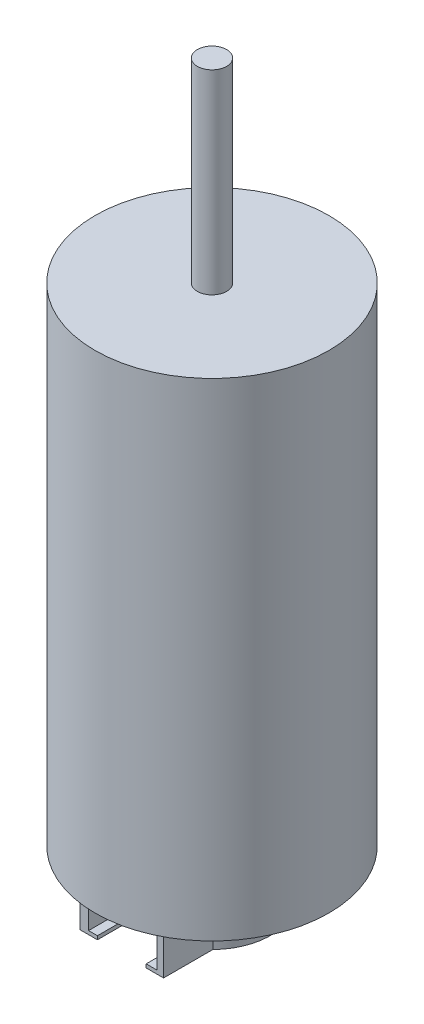
ISO-10303-21;
HEADER;
FILE_DESCRIPTION(('STEP AP214'),'2;1');
FILE_NAME('part.step','',(''),(''),'','','');
FILE_SCHEMA(('AUTOMOTIVE_DESIGN { 1 0 10303 214 1 1 1 1 }'));
ENDSEC;
DATA;
#1=APPLICATION_CONTEXT('core data for automotive mechanical design processes');
#2=APPLICATION_PROTOCOL_DEFINITION('international standard','automotive_design',2000,#1);
#3=PRODUCT_CONTEXT('',#1,'mechanical');
#4=PRODUCT('Part','Part','',(#3));
#5=PRODUCT_RELATED_PRODUCT_CATEGORY('part','',(#4));
#6=PRODUCT_DEFINITION_FORMATION('','',#4);
#7=PRODUCT_DEFINITION_CONTEXT('part definition',#1,'design');
#8=PRODUCT_DEFINITION('design','',#6,#7);
#9=PRODUCT_DEFINITION_SHAPE('','',#8);
#10=(LENGTH_UNIT() NAMED_UNIT(*) SI_UNIT(.MILLI.,.METRE.));
#11=(NAMED_UNIT(*) PLANE_ANGLE_UNIT() SI_UNIT($,.RADIAN.));
#12=(NAMED_UNIT(*) SI_UNIT($,.STERADIAN.) SOLID_ANGLE_UNIT());
#13=UNCERTAINTY_MEASURE_WITH_UNIT(LENGTH_MEASURE(1.E-05),#10,'distance_accuracy_value','');
#14=(GEOMETRIC_REPRESENTATION_CONTEXT(3) GLOBAL_UNCERTAINTY_ASSIGNED_CONTEXT((#13)) GLOBAL_UNIT_ASSIGNED_CONTEXT((#10,
#11,#12)) REPRESENTATION_CONTEXT('',''));
#15=CARTESIAN_POINT('',(0.,0.,0.));
#16=DIRECTION('',(0.,0.,1.));
#17=DIRECTION('',(1.,0.,0.));
#18=AXIS2_PLACEMENT_3D('',#15,#16,#17);
#19=CARTESIAN_POINT('',(0.,0.,0.));
#20=DIRECTION('',(0.,1.,0.));
#21=DIRECTION('',(0.,0.,1.));
#22=AXIS2_PLACEMENT_3D('',#19,#20,#21);
#23=PLANE('',#22);
#24=CARTESIAN_POINT('',(0.,0.,0.));
#25=DIRECTION('',(0.,1.,0.));
#26=DIRECTION('',(0.,0.,1.));
#27=AXIS2_PLACEMENT_3D('',#24,#25,#26);
#28=CIRCLE('',#27,12.);
#29=CARTESIAN_POINT('',(0.,0.,12.));
#30=VERTEX_POINT('',#29);
#31=EDGE_CURVE('E262',#30,#30,#28,.T.);
#32=ORIENTED_EDGE('',*,*,#31,.F.);
#33=EDGE_LOOP('',(#32));
#34=FACE_BOUND('',#33,.T.);
#35=CARTESIAN_POINT('',(0.,0.,0.));
#36=DIRECTION('',(0.,-1.,0.));
#37=DIRECTION('',(0.,0.,-1.));
#38=AXIS2_PLACEMENT_3D('',#35,#36,#37);
#39=CIRCLE('',#38,6.);
#40=CARTESIAN_POINT('',(-4.28427299081036,0.,4.20059578395884));
#41=VERTEX_POINT('',#40);
#42=CARTESIAN_POINT('',(4.28427299081036,0.,4.20059578395884));
#43=VERTEX_POINT('',#42);
#44=EDGE_CURVE('E203',#41,#43,#39,.T.);
#45=ORIENTED_EDGE('',*,*,#44,.F.);
#46=DIRECTION('',(0.,0.,-1.));
#47=VECTOR('',#46,1.);
#48=CARTESIAN_POINT('',(-4.28427299081036,0.,4.20059578395884));
#49=LINE('',#48,#47);
#50=CARTESIAN_POINT('',(-4.28427299081036,0.,9.2543528496582));
#51=VERTEX_POINT('',#50);
#52=EDGE_CURVE('E217',#51,#41,#49,.T.);
#53=ORIENTED_EDGE('',*,*,#52,.F.);
#54=DIRECTION('',(-1.,0.,0.));
#55=VECTOR('',#54,1.);
#56=CARTESIAN_POINT('',(-4.28427299081036,0.,9.2543528496582));
#57=LINE('',#56,#55);
#58=CARTESIAN_POINT('',(4.28427299081036,0.,9.2543528496582));
#59=VERTEX_POINT('',#58);
#60=EDGE_CURVE('E235',#59,#51,#57,.T.);
#61=ORIENTED_EDGE('',*,*,#60,.F.);
#62=DIRECTION('',(0.,0.,1.));
#63=VECTOR('',#62,1.);
#64=CARTESIAN_POINT('',(4.28427299081036,0.,4.20059578395884));
#65=LINE('',#64,#63);
#66=EDGE_CURVE('E231',#43,#59,#65,.T.);
#67=ORIENTED_EDGE('',*,*,#66,.F.);
#68=EDGE_LOOP('',(#45,#53,#61,#67));
#69=FACE_BOUND('',#68,.T.);
#70=ADVANCED_FACE('F43',(#34,#69),#23,.F.);
#71=CARTESIAN_POINT('',(0.,50.,0.));
#72=DIRECTION('',(0.,-1.,0.));
#73=DIRECTION('',(0.,0.,-1.));
#74=AXIS2_PLACEMENT_3D('',#71,#72,#73);
#75=CYLINDRICAL_SURFACE('',#74,12.);
#76=CARTESIAN_POINT('',(0.,50.,0.));
#77=DIRECTION('',(0.,1.,0.));
#78=DIRECTION('',(0.,0.,1.));
#79=AXIS2_PLACEMENT_3D('',#76,#77,#78);
#80=CIRCLE('',#79,12.);
#81=CARTESIAN_POINT('',(0.,50.,12.));
#82=VERTEX_POINT('',#81);
#83=EDGE_CURVE('E266',#82,#82,#80,.T.);
#84=ORIENTED_EDGE('',*,*,#83,.F.);
#85=EDGE_LOOP('',(#84));
#86=FACE_BOUND('',#85,.T.);
#87=ORIENTED_EDGE('',*,*,#31,.T.);
#88=EDGE_LOOP('',(#87));
#89=FACE_BOUND('',#88,.T.);
#90=ADVANCED_FACE('F45',(#86,#89),#75,.T.);
#91=CARTESIAN_POINT('',(0.,50.,0.));
#92=DIRECTION('',(0.,1.,0.));
#93=DIRECTION('',(0.,0.,1.));
#94=AXIS2_PLACEMENT_3D('',#91,#92,#93);
#95=PLANE('',#94);
#96=CARTESIAN_POINT('',(0.,50.,0.));
#97=DIRECTION('',(0.,1.,0.));
#98=DIRECTION('',(0.,0.,1.));
#99=AXIS2_PLACEMENT_3D('',#96,#97,#98);
#100=CIRCLE('',#99,1.5);
#101=CARTESIAN_POINT('',(0.,50.,1.5));
#102=VERTEX_POINT('',#101);
#103=EDGE_CURVE('E257',#102,#102,#100,.T.);
#104=ORIENTED_EDGE('',*,*,#103,.F.);
#105=EDGE_LOOP('',(#104));
#106=FACE_BOUND('',#105,.T.);
#107=ORIENTED_EDGE('',*,*,#83,.T.);
#108=EDGE_LOOP('',(#107));
#109=FACE_BOUND('',#108,.T.);
#110=ADVANCED_FACE('F304',(#106,#109),#95,.T.);
#111=CARTESIAN_POINT('',(0.,70.,0.));
#112=DIRECTION('',(0.,-1.,0.));
#113=DIRECTION('',(0.,0.,-1.));
#114=AXIS2_PLACEMENT_3D('',#111,#112,#113);
#115=CYLINDRICAL_SURFACE('',#114,1.5);
#116=CARTESIAN_POINT('',(0.,70.,0.));
#117=DIRECTION('',(0.,1.,0.));
#118=DIRECTION('',(0.,0.,1.));
#119=AXIS2_PLACEMENT_3D('',#116,#117,#118);
#120=CIRCLE('',#119,1.5);
#121=CARTESIAN_POINT('',(0.,70.,1.5));
#122=VERTEX_POINT('',#121);
#123=EDGE_CURVE('E258',#122,#122,#120,.T.);
#124=ORIENTED_EDGE('',*,*,#123,.F.);
#125=EDGE_LOOP('',(#124));
#126=FACE_BOUND('',#125,.T.);
#127=ORIENTED_EDGE('',*,*,#103,.T.);
#128=EDGE_LOOP('',(#127));
#129=FACE_BOUND('',#128,.T.);
#130=ADVANCED_FACE('F310',(#126,#129),#115,.T.);
#131=CARTESIAN_POINT('',(0.,70.,0.));
#132=DIRECTION('',(0.,1.,0.));
#133=DIRECTION('',(0.,0.,1.));
#134=AXIS2_PLACEMENT_3D('',#131,#132,#133);
#135=PLANE('',#134);
#136=ORIENTED_EDGE('',*,*,#123,.T.);
#137=EDGE_LOOP('',(#136));
#138=FACE_BOUND('',#137,.T.);
#139=ADVANCED_FACE('F314',(#138),#135,.T.);
#140=CARTESIAN_POINT('',(0.,-5.,0.));
#141=DIRECTION('',(0.,1.,0.));
#142=DIRECTION('',(0.,0.,1.));
#143=AXIS2_PLACEMENT_3D('',#140,#141,#142);
#144=CYLINDRICAL_SURFACE('',#143,6.);
#145=ORIENTED_EDGE('',*,*,#44,.T.);
#146=DIRECTION('',(0.,1.,0.));
#147=VECTOR('',#146,1.);
#148=CARTESIAN_POINT('',(4.28427299081036,-5.,4.20059578395884));
#149=LINE('',#148,#147);
#150=CARTESIAN_POINT('',(4.28427299081036,-5.,4.20059578395884));
#151=VERTEX_POINT('',#150);
#152=EDGE_CURVE('E253',#151,#43,#149,.T.);
#153=ORIENTED_EDGE('',*,*,#152,.F.);
#154=CARTESIAN_POINT('',(0.,-5.,0.));
#155=DIRECTION('',(0.,-1.,0.));
#156=DIRECTION('',(0.,0.,-1.));
#157=AXIS2_PLACEMENT_3D('',#154,#155,#156);
#158=CIRCLE('',#157,6.);
#159=CARTESIAN_POINT('',(-4.28427299081036,-5.,4.20059578395884));
#160=VERTEX_POINT('',#159);
#161=EDGE_CURVE('E212',#160,#151,#158,.T.);
#162=ORIENTED_EDGE('',*,*,#161,.F.);
#163=DIRECTION('',(0.,1.,0.));
#164=VECTOR('',#163,1.);
#165=CARTESIAN_POINT('',(-4.28427299081036,-5.,4.20059578395884));
#166=LINE('',#165,#164);
#167=EDGE_CURVE('E227',#160,#41,#166,.T.);
#168=ORIENTED_EDGE('',*,*,#167,.T.);
#169=EDGE_LOOP('',(#145,#153,#162,#168));
#170=FACE_BOUND('',#169,.T.);
#171=ADVANCED_FACE('F294',(#170),#144,.T.);
#172=CARTESIAN_POINT('',(4.28427299081036,-5.,4.20059578395884));
#173=DIRECTION('',(-1.,0.,0.));
#174=DIRECTION('',(0.,0.,1.));
#175=AXIS2_PLACEMENT_3D('',#172,#173,#174);
#176=PLANE('',#175);
#177=ORIENTED_EDGE('',*,*,#66,.T.);
#178=DIRECTION('',(0.,1.,0.));
#179=VECTOR('',#178,1.);
#180=CARTESIAN_POINT('',(4.28427299081036,-5.,9.2543528496582));
#181=LINE('',#180,#179);
#182=CARTESIAN_POINT('',(4.28427299081036,-5.,9.2543528496582));
#183=VERTEX_POINT('',#182);
#184=EDGE_CURVE('E249',#183,#59,#181,.T.);
#185=ORIENTED_EDGE('',*,*,#184,.F.);
#186=DIRECTION('',(0.,0.,1.));
#187=VECTOR('',#186,1.);
#188=CARTESIAN_POINT('',(4.28427299081036,-5.,4.20059578395884));
#189=LINE('',#188,#187);
#190=EDGE_CURVE('E216',#151,#183,#189,.T.);
#191=ORIENTED_EDGE('',*,*,#190,.F.);
#192=ORIENTED_EDGE('',*,*,#152,.T.);
#193=EDGE_LOOP('',(#177,#185,#191,#192));
#194=FACE_BOUND('',#193,.T.);
#195=ADVANCED_FACE('F297',(#194),#176,.F.);
#196=CARTESIAN_POINT('',(-4.28427299081036,-5.,9.2543528496582));
#197=DIRECTION('',(0.,0.,-1.));
#198=DIRECTION('',(-1.,0.,0.));
#199=AXIS2_PLACEMENT_3D('',#196,#197,#198);
#200=PLANE('',#199);
#201=DIRECTION('',(-1.,0.,0.));
#202=VECTOR('',#201,1.);
#203=CARTESIAN_POINT('',(-4.28427299081036,-5.,9.2543528496582));
#204=LINE('',#203,#202);
#205=CARTESIAN_POINT('',(-2.50184735853727,-5.,9.2543528496582));
#206=VERTEX_POINT('',#205);
#207=CARTESIAN_POINT('',(-4.28427299081036,-5.,9.2543528496582));
#208=VERTEX_POINT('',#207);
#209=EDGE_CURVE('E220',#206,#208,#204,.T.);
#210=ORIENTED_EDGE('',*,*,#209,.F.);
#211=DIRECTION('',(0.,-1.,0.));
#212=VECTOR('',#211,1.);
#213=CARTESIAN_POINT('',(-2.50184735853727,-4.6,9.2543528496582));
#214=LINE('',#213,#212);
#215=CARTESIAN_POINT('',(-2.50184735853727,-4.63312767386151,9.2543528496582));
#216=VERTEX_POINT('',#215);
#217=EDGE_CURVE('E148',#216,#206,#214,.T.);
#218=ORIENTED_EDGE('',*,*,#217,.F.);
#219=DIRECTION('',(1.,0.,0.));
#220=VECTOR('',#219,1.);
#221=CARTESIAN_POINT('',(-3.41081273000828,-4.63312767386151,9.2543528496582));
#222=LINE('',#221,#220);
#223=CARTESIAN_POINT('',(-3.41081273000828,-4.63312767386151,9.2543528496582));
#224=VERTEX_POINT('',#223);
#225=EDGE_CURVE('E173',#224,#216,#222,.T.);
#226=ORIENTED_EDGE('',*,*,#225,.F.);
#227=DIRECTION('',(0.,-1.,0.));
#228=VECTOR('',#227,1.);
#229=CARTESIAN_POINT('',(-3.41081273000828,-0.63312767386151,9.2543528496582));
#230=LINE('',#229,#228);
#231=CARTESIAN_POINT('',(-3.41081273000828,-0.63312767386151,9.2543528496582));
#232=VERTEX_POINT('',#231);
#233=EDGE_CURVE('E192',#232,#224,#230,.T.);
#234=ORIENTED_EDGE('',*,*,#233,.F.);
#235=DIRECTION('',(-1.,0.,0.));
#236=VECTOR('',#235,1.);
#237=CARTESIAN_POINT('',(-3.41081273000828,-0.63312767386151,9.2543528496582));
#238=LINE('',#237,#236);
#239=CARTESIAN_POINT('',(3.58918726999172,-0.63312767386151,9.2543528496582));
#240=VERTEX_POINT('',#239);
#241=EDGE_CURVE('E188',#240,#232,#238,.T.);
#242=ORIENTED_EDGE('',*,*,#241,.F.);
#243=DIRECTION('',(0.,1.,0.));
#244=VECTOR('',#243,1.);
#245=CARTESIAN_POINT('',(3.58918726999172,-0.63312767386151,9.2543528496582));
#246=LINE('',#245,#244);
#247=CARTESIAN_POINT('',(3.58918726999172,-4.63312767386151,9.2543528496582));
#248=VERTEX_POINT('',#247);
#249=EDGE_CURVE('E67',#248,#240,#246,.T.);
#250=ORIENTED_EDGE('',*,*,#249,.F.);
#251=CARTESIAN_POINT('',(2.49815264146273,-4.63312767386151,9.2543528496582));
#252=VERTEX_POINT('',#251);
#253=EDGE_CURVE('E196',#252,#248,#222,.T.);
#254=ORIENTED_EDGE('',*,*,#253,.F.);
#255=DIRECTION('',(0.,-1.,0.));
#256=VECTOR('',#255,1.);
#257=CARTESIAN_POINT('',(2.49815264146273,-4.6,9.2543528496582));
#258=LINE('',#257,#256);
#259=CARTESIAN_POINT('',(2.49815264146273,-5.,9.2543528496582));
#260=VERTEX_POINT('',#259);
#261=EDGE_CURVE('E162',#252,#260,#258,.T.);
#262=ORIENTED_EDGE('',*,*,#261,.T.);
#263=EDGE_CURVE('E221',#183,#260,#204,.T.);
#264=ORIENTED_EDGE('',*,*,#263,.F.);
#265=ORIENTED_EDGE('',*,*,#184,.T.);
#266=ORIENTED_EDGE('',*,*,#60,.T.);
#267=DIRECTION('',(0.,1.,0.));
#268=VECTOR('',#267,1.);
#269=CARTESIAN_POINT('',(-4.28427299081036,-5.,9.2543528496582));
#270=LINE('',#269,#268);
#271=EDGE_CURVE('E245',#208,#51,#270,.T.);
#272=ORIENTED_EDGE('',*,*,#271,.F.);
#273=EDGE_LOOP('',(#210,#218,#226,#234,#242,#250,#254,#262,#264,#265,#266,#272));
#274=FACE_BOUND('',#273,.T.);
#275=ADVANCED_FACE('F281',(#274),#200,.F.);
#276=CARTESIAN_POINT('',(-4.28427299081036,-5.,4.20059578395884));
#277=DIRECTION('',(1.,0.,0.));
#278=DIRECTION('',(0.,0.,-1.));
#279=AXIS2_PLACEMENT_3D('',#276,#277,#278);
#280=PLANE('',#279);
#281=ORIENTED_EDGE('',*,*,#52,.T.);
#282=ORIENTED_EDGE('',*,*,#167,.F.);
#283=DIRECTION('',(0.,0.,-1.));
#284=VECTOR('',#283,1.);
#285=CARTESIAN_POINT('',(-4.28427299081036,-5.,4.20059578395884));
#286=LINE('',#285,#284);
#287=EDGE_CURVE('E224',#208,#160,#286,.T.);
#288=ORIENTED_EDGE('',*,*,#287,.F.);
#289=ORIENTED_EDGE('',*,*,#271,.T.);
#290=EDGE_LOOP('',(#281,#282,#288,#289));
#291=FACE_BOUND('',#290,.T.);
#292=ADVANCED_FACE('F290',(#291),#280,.F.);
#293=CARTESIAN_POINT('',(0.,-5.,0.));
#294=DIRECTION('',(0.,-1.,0.));
#295=DIRECTION('',(0.,0.,-1.));
#296=AXIS2_PLACEMENT_3D('',#293,#294,#295);
#297=PLANE('',#296);
#298=DIRECTION('',(0.,0.,-1.));
#299=VECTOR('',#298,1.);
#300=CARTESIAN_POINT('',(-2.50184735853727,-5.,9.2543528496582));
#301=LINE('',#300,#299);
#302=CARTESIAN_POINT('',(-2.50184735853727,-5.,5.80374124882916));
#303=VERTEX_POINT('',#302);
#304=EDGE_CURVE('E145',#206,#303,#301,.T.);
#305=ORIENTED_EDGE('',*,*,#304,.F.);
#306=ORIENTED_EDGE('',*,*,#209,.T.);
#307=ORIENTED_EDGE('',*,*,#287,.T.);
#308=ORIENTED_EDGE('',*,*,#161,.T.);
#309=ORIENTED_EDGE('',*,*,#190,.T.);
#310=ORIENTED_EDGE('',*,*,#263,.T.);
#311=DIRECTION('',(0.,0.,1.));
#312=VECTOR('',#311,1.);
#313=CARTESIAN_POINT('',(2.49815264146273,-5.,9.2543528496582));
#314=LINE('',#313,#312);
#315=CARTESIAN_POINT('',(2.49815264146273,-5.,5.80374124882916));
#316=VERTEX_POINT('',#315);
#317=EDGE_CURVE('E142',#316,#260,#314,.T.);
#318=ORIENTED_EDGE('',*,*,#317,.F.);
#319=DIRECTION('',(1.,0.,0.));
#320=VECTOR('',#319,1.);
#321=CARTESIAN_POINT('',(-2.50184735853727,-5.,5.80374124882916));
#322=LINE('',#321,#320);
#323=EDGE_CURVE('E136',#303,#316,#322,.T.);
#324=ORIENTED_EDGE('',*,*,#323,.F.);
#325=EDGE_LOOP('',(#305,#306,#307,#308,#309,#310,#318,#324));
#326=FACE_BOUND('',#325,.T.);
#327=ADVANCED_FACE('F153',(#326),#297,.T.);
#328=CARTESIAN_POINT('',(3.58918726999172,-0.63312767386151,4.2543528496582));
#329=DIRECTION('',(1.,0.,0.));
#330=DIRECTION('',(0.,1.,0.));
#331=AXIS2_PLACEMENT_3D('',#328,#329,#330);
#332=PLANE('',#331);
#333=ORIENTED_EDGE('',*,*,#249,.T.);
#334=DIRECTION('',(0.,0.,1.));
#335=VECTOR('',#334,1.);
#336=CARTESIAN_POINT('',(3.58918726999172,-0.63312767386151,4.2543528496582));
#337=LINE('',#336,#335);
#338=CARTESIAN_POINT('',(3.58918726999172,-0.63312767386151,4.2543528496582));
#339=VERTEX_POINT('',#338);
#340=EDGE_CURVE('E185',#339,#240,#337,.T.);
#341=ORIENTED_EDGE('',*,*,#340,.F.);
#342=DIRECTION('',(0.,1.,0.));
#343=VECTOR('',#342,1.);
#344=CARTESIAN_POINT('',(3.58918726999172,-0.63312767386151,4.2543528496582));
#345=LINE('',#344,#343);
#346=CARTESIAN_POINT('',(3.58918726999172,-4.63312767386151,4.2543528496582));
#347=VERTEX_POINT('',#346);
#348=EDGE_CURVE('E168',#347,#339,#345,.T.);
#349=ORIENTED_EDGE('',*,*,#348,.F.);
#350=DIRECTION('',(0.,0.,1.));
#351=VECTOR('',#350,1.);
#352=CARTESIAN_POINT('',(3.58918726999172,-4.63312767386151,4.2543528496582));
#353=LINE('',#352,#351);
#354=EDGE_CURVE('E200',#347,#248,#353,.T.);
#355=ORIENTED_EDGE('',*,*,#354,.T.);
#356=EDGE_LOOP('',(#333,#341,#349,#355));
#357=FACE_BOUND('',#356,.T.);
#358=ADVANCED_FACE('F329',(#357),#332,.F.);
#359=CARTESIAN_POINT('',(-3.41081273000828,-4.63312767386151,4.2543528496582));
#360=DIRECTION('',(0.,-1.,0.));
#361=DIRECTION('',(0.,0.,-1.));
#362=AXIS2_PLACEMENT_3D('',#359,#360,#361);
#363=PLANE('',#362);
#364=ORIENTED_EDGE('',*,*,#225,.T.);
#365=DIRECTION('',(0.,0.,-1.));
#366=VECTOR('',#365,1.);
#367=CARTESIAN_POINT('',(-2.50184735853727,-4.63312767386151,4.2543528496582));
#368=LINE('',#367,#366);
#369=CARTESIAN_POINT('',(-2.50184735853727,-4.63312767386151,5.80374124882916));
#370=VERTEX_POINT('',#369);
#371=EDGE_CURVE('E11',#216,#370,#368,.T.);
#372=ORIENTED_EDGE('',*,*,#371,.T.);
#373=DIRECTION('',(1.,0.,0.));
#374=VECTOR('',#373,1.);
#375=CARTESIAN_POINT('',(-3.41081273000828,-4.63312767386151,5.80374124882916));
#376=LINE('',#375,#374);
#377=CARTESIAN_POINT('',(2.49815264146273,-4.63312767386151,5.80374124882916));
#378=VERTEX_POINT('',#377);
#379=EDGE_CURVE('E139',#370,#378,#376,.T.);
#380=ORIENTED_EDGE('',*,*,#379,.T.);
#381=DIRECTION('',(0.,0.,1.));
#382=VECTOR('',#381,1.);
#383=CARTESIAN_POINT('',(2.49815264146273,-4.63312767386151,4.2543528496582));
#384=LINE('',#383,#382);
#385=EDGE_CURVE('E52',#378,#252,#384,.T.);
#386=ORIENTED_EDGE('',*,*,#385,.T.);
#387=ORIENTED_EDGE('',*,*,#253,.T.);
#388=ORIENTED_EDGE('',*,*,#354,.F.);
#389=DIRECTION('',(1.,0.,0.));
#390=VECTOR('',#389,1.);
#391=CARTESIAN_POINT('',(-3.41081273000828,-4.63312767386151,4.2543528496582));
#392=LINE('',#391,#390);
#393=CARTESIAN_POINT('',(-3.41081273000828,-4.63312767386151,4.2543528496582));
#394=VERTEX_POINT('',#393);
#395=EDGE_CURVE('E181',#394,#347,#392,.T.);
#396=ORIENTED_EDGE('',*,*,#395,.F.);
#397=DIRECTION('',(0.,0.,1.));
#398=VECTOR('',#397,1.);
#399=CARTESIAN_POINT('',(-3.41081273000828,-4.63312767386151,4.2543528496582));
#400=LINE('',#399,#398);
#401=EDGE_CURVE('E204',#394,#224,#400,.T.);
#402=ORIENTED_EDGE('',*,*,#401,.T.);
#403=EDGE_LOOP('',(#364,#372,#380,#386,#387,#388,#396,#402));
#404=FACE_BOUND('',#403,.T.);
#405=ADVANCED_FACE('F278',(#404),#363,.F.);
#406=CARTESIAN_POINT('',(-3.41081273000828,-0.63312767386151,4.2543528496582));
#407=DIRECTION('',(-1.,0.,0.));
#408=DIRECTION('',(0.,-1.,0.));
#409=AXIS2_PLACEMENT_3D('',#406,#407,#408);
#410=PLANE('',#409);
#411=ORIENTED_EDGE('',*,*,#233,.T.);
#412=ORIENTED_EDGE('',*,*,#401,.F.);
#413=DIRECTION('',(0.,-1.,0.));
#414=VECTOR('',#413,1.);
#415=CARTESIAN_POINT('',(-3.41081273000828,-0.63312767386151,4.2543528496582));
#416=LINE('',#415,#414);
#417=CARTESIAN_POINT('',(-3.41081273000828,-0.63312767386151,4.2543528496582));
#418=VERTEX_POINT('',#417);
#419=EDGE_CURVE('E177',#418,#394,#416,.T.);
#420=ORIENTED_EDGE('',*,*,#419,.F.);
#421=DIRECTION('',(0.,0.,1.));
#422=VECTOR('',#421,1.);
#423=CARTESIAN_POINT('',(-3.41081273000828,-0.63312767386151,4.2543528496582));
#424=LINE('',#423,#422);
#425=EDGE_CURVE('E207',#418,#232,#424,.T.);
#426=ORIENTED_EDGE('',*,*,#425,.T.);
#427=EDGE_LOOP('',(#411,#412,#420,#426));
#428=FACE_BOUND('',#427,.T.);
#429=ADVANCED_FACE('F336',(#428),#410,.F.);
#430=CARTESIAN_POINT('',(-3.41081273000828,-0.63312767386151,4.2543528496582));
#431=DIRECTION('',(0.,1.,0.));
#432=DIRECTION('',(0.,0.,1.));
#433=AXIS2_PLACEMENT_3D('',#430,#431,#432);
#434=PLANE('',#433);
#435=ORIENTED_EDGE('',*,*,#241,.T.);
#436=ORIENTED_EDGE('',*,*,#425,.F.);
#437=DIRECTION('',(-1.,0.,0.));
#438=VECTOR('',#437,1.);
#439=CARTESIAN_POINT('',(-3.41081273000828,-0.63312767386151,4.2543528496582));
#440=LINE('',#439,#438);
#441=EDGE_CURVE('E172',#339,#418,#440,.T.);
#442=ORIENTED_EDGE('',*,*,#441,.F.);
#443=ORIENTED_EDGE('',*,*,#340,.T.);
#444=EDGE_LOOP('',(#435,#436,#442,#443));
#445=FACE_BOUND('',#444,.T.);
#446=ADVANCED_FACE('F332',(#445),#434,.F.);
#447=CARTESIAN_POINT('',(0.,0.,4.2543528496582));
#448=DIRECTION('',(0.,0.,1.));
#449=DIRECTION('',(1.,0.,0.));
#450=AXIS2_PLACEMENT_3D('',#447,#448,#449);
#451=PLANE('',#450);
#452=ORIENTED_EDGE('',*,*,#348,.T.);
#453=ORIENTED_EDGE('',*,*,#441,.T.);
#454=ORIENTED_EDGE('',*,*,#419,.T.);
#455=ORIENTED_EDGE('',*,*,#395,.T.);
#456=EDGE_LOOP('',(#452,#453,#454,#455));
#457=FACE_BOUND('',#456,.T.);
#458=ADVANCED_FACE('F335',(#457),#451,.T.);
#459=CARTESIAN_POINT('',(-2.50184735853727,-4.6,9.2543528496582));
#460=DIRECTION('',(-1.,0.,0.));
#461=DIRECTION('',(0.,0.,1.));
#462=AXIS2_PLACEMENT_3D('',#459,#460,#461);
#463=PLANE('',#462);
#464=ORIENTED_EDGE('',*,*,#217,.T.);
#465=ORIENTED_EDGE('',*,*,#304,.T.);
#466=DIRECTION('',(0.,-1.,0.));
#467=VECTOR('',#466,1.);
#468=CARTESIAN_POINT('',(-2.50184735853727,-4.6,5.80374124882916));
#469=LINE('',#468,#467);
#470=EDGE_CURVE('E132',#370,#303,#469,.T.);
#471=ORIENTED_EDGE('',*,*,#470,.F.);
#472=ORIENTED_EDGE('',*,*,#371,.F.);
#473=EDGE_LOOP('',(#464,#465,#471,#472));
#474=FACE_BOUND('',#473,.T.);
#475=ADVANCED_FACE('F146',(#474),#463,.F.);
#476=CARTESIAN_POINT('',(2.49815264146273,-4.6,9.2543528496582));
#477=DIRECTION('',(1.,0.,0.));
#478=DIRECTION('',(0.,0.,-1.));
#479=AXIS2_PLACEMENT_3D('',#476,#477,#478);
#480=PLANE('',#479);
#481=DIRECTION('',(0.,-1.,0.));
#482=VECTOR('',#481,1.);
#483=CARTESIAN_POINT('',(2.49815264146273,-4.6,5.80374124882916));
#484=LINE('',#483,#482);
#485=EDGE_CURVE('E59',#378,#316,#484,.T.);
#486=ORIENTED_EDGE('',*,*,#485,.T.);
#487=ORIENTED_EDGE('',*,*,#317,.T.);
#488=ORIENTED_EDGE('',*,*,#261,.F.);
#489=ORIENTED_EDGE('',*,*,#385,.F.);
#490=EDGE_LOOP('',(#486,#487,#488,#489));
#491=FACE_BOUND('',#490,.T.);
#492=ADVANCED_FACE('F348',(#491),#480,.F.);
#493=CARTESIAN_POINT('',(-2.50184735853727,-4.6,5.80374124882916));
#494=DIRECTION('',(0.,0.,-1.));
#495=DIRECTION('',(-1.,0.,0.));
#496=AXIS2_PLACEMENT_3D('',#493,#494,#495);
#497=PLANE('',#496);
#498=ORIENTED_EDGE('',*,*,#470,.T.);
#499=ORIENTED_EDGE('',*,*,#323,.T.);
#500=ORIENTED_EDGE('',*,*,#485,.F.);
#501=ORIENTED_EDGE('',*,*,#379,.F.);
#502=EDGE_LOOP('',(#498,#499,#500,#501));
#503=FACE_BOUND('',#502,.T.);
#504=ADVANCED_FACE('F134',(#503),#497,.F.);
#505=CLOSED_SHELL('',(#70,#90,#110,#130,#139,#171,#195,#275,#292,#327,#358,#405,#429,#446,#458,
#475,#492,#504));
#506=MANIFOLD_SOLID_BREP('B2',#505);
#507=ADVANCED_BREP_SHAPE_REPRESENTATION('',(#18,#506),#14);
#508=SHAPE_DEFINITION_REPRESENTATION(#9,#507);
ENDSEC;
END-ISO-10303-21;
